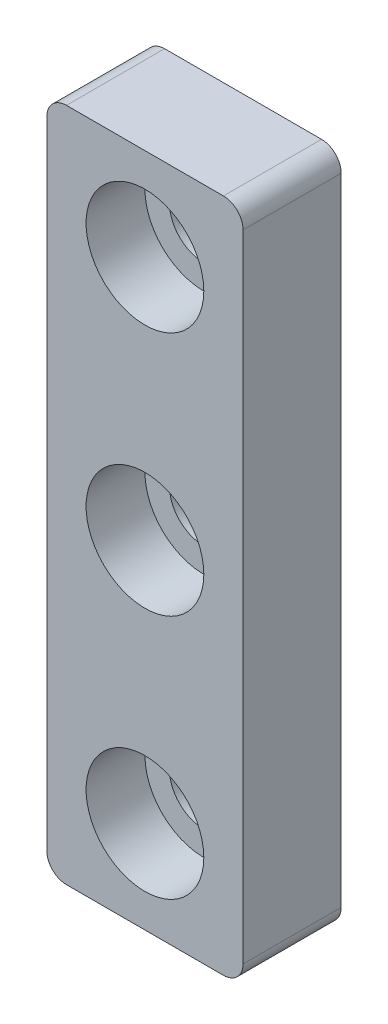
ISO-10303-21;
HEADER;
FILE_DESCRIPTION(('STEP AP214'),'2;1');
FILE_NAME('part.step','',(''),(''),'','','');
FILE_SCHEMA(('AUTOMOTIVE_DESIGN { 1 0 10303 214 1 1 1 1 }'));
ENDSEC;
DATA;
#1=APPLICATION_CONTEXT('core data for automotive mechanical design processes');
#2=APPLICATION_PROTOCOL_DEFINITION('international standard','automotive_design',2000,#1);
#3=PRODUCT_CONTEXT('',#1,'mechanical');
#4=PRODUCT('Part','Part','',(#3));
#5=PRODUCT_RELATED_PRODUCT_CATEGORY('part','',(#4));
#6=PRODUCT_DEFINITION_FORMATION('','',#4);
#7=PRODUCT_DEFINITION_CONTEXT('part definition',#1,'design');
#8=PRODUCT_DEFINITION('design','',#6,#7);
#9=PRODUCT_DEFINITION_SHAPE('','',#8);
#10=(LENGTH_UNIT() NAMED_UNIT(*) SI_UNIT(.MILLI.,.METRE.));
#11=(NAMED_UNIT(*) PLANE_ANGLE_UNIT() SI_UNIT($,.RADIAN.));
#12=(NAMED_UNIT(*) SI_UNIT($,.STERADIAN.) SOLID_ANGLE_UNIT());
#13=UNCERTAINTY_MEASURE_WITH_UNIT(LENGTH_MEASURE(1.E-05),#10,'distance_accuracy_value','');
#14=(GEOMETRIC_REPRESENTATION_CONTEXT(3) GLOBAL_UNCERTAINTY_ASSIGNED_CONTEXT((#13)) GLOBAL_UNIT_ASSIGNED_CONTEXT((#10,
#11,#12)) REPRESENTATION_CONTEXT('',''));
#15=CARTESIAN_POINT('',(0.,0.,0.));
#16=DIRECTION('',(0.,0.,1.));
#17=DIRECTION('',(1.,0.,0.));
#18=AXIS2_PLACEMENT_3D('',#15,#16,#17);
#19=CARTESIAN_POINT('',(0.,-12.5,0.));
#20=DIRECTION('',(0.,0.,1.));
#21=DIRECTION('',(1.,0.,0.));
#22=AXIS2_PLACEMENT_3D('',#19,#20,#21);
#23=CYLINDRICAL_SURFACE('',#22,1.75);
#24=CARTESIAN_POINT('',(0.,-12.5,0.));
#25=DIRECTION('',(0.,0.,1.));
#26=DIRECTION('',(1.,0.,0.));
#27=AXIS2_PLACEMENT_3D('',#24,#25,#26);
#28=CIRCLE('',#27,1.75);
#29=CARTESIAN_POINT('',(1.75,-12.5,0.));
#30=VERTEX_POINT('',#29);
#31=EDGE_CURVE('E167',#30,#30,#28,.T.);
#32=ORIENTED_EDGE('',*,*,#31,.F.);
#33=EDGE_LOOP('',(#32));
#34=FACE_BOUND('',#33,.T.);
#35=CARTESIAN_POINT('',(0.,-12.5,2.));
#36=DIRECTION('',(0.,0.,1.));
#37=DIRECTION('',(1.,0.,0.));
#38=AXIS2_PLACEMENT_3D('',#35,#36,#37);
#39=CIRCLE('',#38,1.75);
#40=CARTESIAN_POINT('',(1.75,-12.5,2.));
#41=VERTEX_POINT('',#40);
#42=EDGE_CURVE('E41',#41,#41,#39,.F.);
#43=ORIENTED_EDGE('',*,*,#42,.F.);
#44=EDGE_LOOP('',(#43));
#45=FACE_BOUND('',#44,.T.);
#46=ADVANCED_FACE('F37',(#34,#45),#23,.F.);
#47=CARTESIAN_POINT('',(0.,0.,0.));
#48=DIRECTION('',(0.,0.,1.));
#49=DIRECTION('',(1.,0.,0.));
#50=AXIS2_PLACEMENT_3D('',#47,#48,#49);
#51=CYLINDRICAL_SURFACE('',#50,1.75);
#52=CARTESIAN_POINT('',(0.,0.,0.));
#53=DIRECTION('',(0.,0.,1.));
#54=DIRECTION('',(1.,0.,0.));
#55=AXIS2_PLACEMENT_3D('',#52,#53,#54);
#56=CIRCLE('',#55,1.75);
#57=CARTESIAN_POINT('',(1.75,0.,0.));
#58=VERTEX_POINT('',#57);
#59=EDGE_CURVE('E137',#58,#58,#56,.T.);
#60=ORIENTED_EDGE('',*,*,#59,.F.);
#61=EDGE_LOOP('',(#60));
#62=FACE_BOUND('',#61,.T.);
#63=CARTESIAN_POINT('',(0.,0.,2.));
#64=DIRECTION('',(0.,0.,1.));
#65=DIRECTION('',(1.,0.,0.));
#66=AXIS2_PLACEMENT_3D('',#63,#64,#65);
#67=CIRCLE('',#66,1.75);
#68=CARTESIAN_POINT('',(1.75,0.,2.));
#69=VERTEX_POINT('',#68);
#70=EDGE_CURVE('E169',#69,#69,#67,.F.);
#71=ORIENTED_EDGE('',*,*,#70,.F.);
#72=EDGE_LOOP('',(#71));
#73=FACE_BOUND('',#72,.T.);
#74=ADVANCED_FACE('F229',(#62,#73),#51,.F.);
#75=CARTESIAN_POINT('',(0.,12.5,0.));
#76=DIRECTION('',(0.,0.,1.));
#77=DIRECTION('',(1.,0.,0.));
#78=AXIS2_PLACEMENT_3D('',#75,#76,#77);
#79=CYLINDRICAL_SURFACE('',#78,1.75);
#80=CARTESIAN_POINT('',(0.,12.5,0.));
#81=DIRECTION('',(0.,0.,1.));
#82=DIRECTION('',(1.,0.,0.));
#83=AXIS2_PLACEMENT_3D('',#80,#81,#82);
#84=CIRCLE('',#83,1.75);
#85=CARTESIAN_POINT('',(1.75,12.5,0.));
#86=VERTEX_POINT('',#85);
#87=EDGE_CURVE('E192',#86,#86,#84,.T.);
#88=ORIENTED_EDGE('',*,*,#87,.F.);
#89=EDGE_LOOP('',(#88));
#90=FACE_BOUND('',#89,.T.);
#91=CARTESIAN_POINT('',(0.,12.5,2.));
#92=DIRECTION('',(0.,0.,1.));
#93=DIRECTION('',(1.,0.,0.));
#94=AXIS2_PLACEMENT_3D('',#91,#92,#93);
#95=CIRCLE('',#94,1.75);
#96=CARTESIAN_POINT('',(1.75,12.5,2.));
#97=VERTEX_POINT('',#96);
#98=EDGE_CURVE('E165',#97,#97,#95,.F.);
#99=ORIENTED_EDGE('',*,*,#98,.F.);
#100=EDGE_LOOP('',(#99));
#101=FACE_BOUND('',#100,.T.);
#102=ADVANCED_FACE('F235',(#90,#101),#79,.F.);
#103=CARTESIAN_POINT('',(-5.,17.2,5.));
#104=DIRECTION('',(1.,0.,0.));
#105=DIRECTION('',(0.,1.,0.));
#106=AXIS2_PLACEMENT_3D('',#103,#104,#105);
#107=PLANE('',#106);
#108=DIRECTION('',(0.,-1.,0.));
#109=VECTOR('',#108,1.);
#110=CARTESIAN_POINT('',(-5.,17.2,0.));
#111=LINE('',#110,#109);
#112=CARTESIAN_POINT('',(-5.,16.2,0.));
#113=VERTEX_POINT('',#112);
#114=CARTESIAN_POINT('',(-5.,-16.2,0.));
#115=VERTEX_POINT('',#114);
#116=EDGE_CURVE('E132',#113,#115,#111,.T.);
#117=ORIENTED_EDGE('',*,*,#116,.T.);
#118=DIRECTION('',(0.,0.,-1.));
#119=VECTOR('',#118,1.);
#120=CARTESIAN_POINT('',(-5.,-16.2,5.));
#121=LINE('',#120,#119);
#122=CARTESIAN_POINT('',(-5.,-16.2,5.));
#123=VERTEX_POINT('',#122);
#124=EDGE_CURVE('E110',#115,#123,#121,.F.);
#125=ORIENTED_EDGE('',*,*,#124,.T.);
#126=DIRECTION('',(0.,-1.,0.));
#127=VECTOR('',#126,1.);
#128=CARTESIAN_POINT('',(-5.,17.2,5.));
#129=LINE('',#128,#127);
#130=CARTESIAN_POINT('',(-5.,16.2,5.));
#131=VERTEX_POINT('',#130);
#132=EDGE_CURVE('E142',#131,#123,#129,.T.);
#133=ORIENTED_EDGE('',*,*,#132,.F.);
#134=DIRECTION('',(0.,0.,-1.));
#135=VECTOR('',#134,1.);
#136=CARTESIAN_POINT('',(-5.,16.2,5.));
#137=LINE('',#136,#135);
#138=EDGE_CURVE('E115',#131,#113,#137,.T.);
#139=ORIENTED_EDGE('',*,*,#138,.T.);
#140=EDGE_LOOP('',(#117,#125,#133,#139));
#141=FACE_BOUND('',#140,.T.);
#142=ADVANCED_FACE('F208',(#141),#107,.F.);
#143=CARTESIAN_POINT('',(5.,-17.2,5.));
#144=DIRECTION('',(0.,1.,0.));
#145=DIRECTION('',(-1.,0.,0.));
#146=AXIS2_PLACEMENT_3D('',#143,#144,#145);
#147=PLANE('',#146);
#148=DIRECTION('',(1.,0.,0.));
#149=VECTOR('',#148,1.);
#150=CARTESIAN_POINT('',(5.,-17.2,5.));
#151=LINE('',#150,#149);
#152=CARTESIAN_POINT('',(-4.,-17.2,5.));
#153=VERTEX_POINT('',#152);
#154=CARTESIAN_POINT('',(4.,-17.2,5.));
#155=VERTEX_POINT('',#154);
#156=EDGE_CURVE('E125',#153,#155,#151,.T.);
#157=ORIENTED_EDGE('',*,*,#156,.F.);
#158=DIRECTION('',(0.,0.,-1.));
#159=VECTOR('',#158,1.);
#160=CARTESIAN_POINT('',(-4.,-17.2,5.));
#161=LINE('',#160,#159);
#162=CARTESIAN_POINT('',(-4.,-17.2,0.));
#163=VERTEX_POINT('',#162);
#164=EDGE_CURVE('E109',#153,#163,#161,.T.);
#165=ORIENTED_EDGE('',*,*,#164,.T.);
#166=DIRECTION('',(1.,0.,0.));
#167=VECTOR('',#166,1.);
#168=CARTESIAN_POINT('',(5.,-17.2,0.));
#169=LINE('',#168,#167);
#170=CARTESIAN_POINT('',(4.,-17.2,0.));
#171=VERTEX_POINT('',#170);
#172=EDGE_CURVE('E122',#163,#171,#169,.T.);
#173=ORIENTED_EDGE('',*,*,#172,.T.);
#174=DIRECTION('',(0.,0.,-1.));
#175=VECTOR('',#174,1.);
#176=CARTESIAN_POINT('',(4.,-17.2,5.));
#177=LINE('',#176,#175);
#178=EDGE_CURVE('E127',#171,#155,#177,.F.);
#179=ORIENTED_EDGE('',*,*,#178,.T.);
#180=EDGE_LOOP('',(#157,#165,#173,#179));
#181=FACE_BOUND('',#180,.T.);
#182=ADVANCED_FACE('F121',(#181),#147,.F.);
#183=CARTESIAN_POINT('',(5.,17.2,5.));
#184=DIRECTION('',(-1.,0.,0.));
#185=DIRECTION('',(0.,-1.,0.));
#186=AXIS2_PLACEMENT_3D('',#183,#184,#185);
#187=PLANE('',#186);
#188=DIRECTION('',(0.,1.,0.));
#189=VECTOR('',#188,1.);
#190=CARTESIAN_POINT('',(5.,17.2,5.));
#191=LINE('',#190,#189);
#192=CARTESIAN_POINT('',(5.,-16.2,5.));
#193=VERTEX_POINT('',#192);
#194=CARTESIAN_POINT('',(5.,16.2,5.));
#195=VERTEX_POINT('',#194);
#196=EDGE_CURVE('E200',#193,#195,#191,.T.);
#197=ORIENTED_EDGE('',*,*,#196,.F.);
#198=DIRECTION('',(0.,0.,-1.));
#199=VECTOR('',#198,1.);
#200=CARTESIAN_POINT('',(5.,-16.2,5.));
#201=LINE('',#200,#199);
#202=CARTESIAN_POINT('',(5.,-16.2,0.));
#203=VERTEX_POINT('',#202);
#204=EDGE_CURVE('E161',#193,#203,#201,.T.);
#205=ORIENTED_EDGE('',*,*,#204,.T.);
#206=DIRECTION('',(0.,1.,0.));
#207=VECTOR('',#206,1.);
#208=CARTESIAN_POINT('',(5.,17.2,0.));
#209=LINE('',#208,#207);
#210=CARTESIAN_POINT('',(5.,16.2,0.));
#211=VERTEX_POINT('',#210);
#212=EDGE_CURVE('E131',#203,#211,#209,.T.);
#213=ORIENTED_EDGE('',*,*,#212,.T.);
#214=DIRECTION('',(0.,0.,-1.));
#215=VECTOR('',#214,1.);
#216=CARTESIAN_POINT('',(5.,16.2,5.));
#217=LINE('',#216,#215);
#218=EDGE_CURVE('E159',#211,#195,#217,.F.);
#219=ORIENTED_EDGE('',*,*,#218,.T.);
#220=EDGE_LOOP('',(#197,#205,#213,#219));
#221=FACE_BOUND('',#220,.T.);
#222=ADVANCED_FACE('F216',(#221),#187,.F.);
#223=CARTESIAN_POINT('',(5.,17.2,5.));
#224=DIRECTION('',(0.,-1.,0.));
#225=DIRECTION('',(1.,0.,0.));
#226=AXIS2_PLACEMENT_3D('',#223,#224,#225);
#227=PLANE('',#226);
#228=DIRECTION('',(-1.,0.,0.));
#229=VECTOR('',#228,1.);
#230=CARTESIAN_POINT('',(5.,17.2,5.));
#231=LINE('',#230,#229);
#232=CARTESIAN_POINT('',(4.,17.2,5.));
#233=VERTEX_POINT('',#232);
#234=CARTESIAN_POINT('',(-4.,17.2,5.));
#235=VERTEX_POINT('',#234);
#236=EDGE_CURVE('E143',#233,#235,#231,.T.);
#237=ORIENTED_EDGE('',*,*,#236,.F.);
#238=DIRECTION('',(0.,0.,-1.));
#239=VECTOR('',#238,1.);
#240=CARTESIAN_POINT('',(4.,17.2,5.));
#241=LINE('',#240,#239);
#242=CARTESIAN_POINT('',(4.,17.2,0.));
#243=VERTEX_POINT('',#242);
#244=EDGE_CURVE('E11',#233,#243,#241,.T.);
#245=ORIENTED_EDGE('',*,*,#244,.T.);
#246=DIRECTION('',(-1.,0.,0.));
#247=VECTOR('',#246,1.);
#248=CARTESIAN_POINT('',(5.,17.2,0.));
#249=LINE('',#248,#247);
#250=CARTESIAN_POINT('',(-4.,17.2,0.));
#251=VERTEX_POINT('',#250);
#252=EDGE_CURVE('E135',#243,#251,#249,.T.);
#253=ORIENTED_EDGE('',*,*,#252,.T.);
#254=DIRECTION('',(0.,0.,-1.));
#255=VECTOR('',#254,1.);
#256=CARTESIAN_POINT('',(-4.,17.2,5.));
#257=LINE('',#256,#255);
#258=EDGE_CURVE('E46',#251,#235,#257,.F.);
#259=ORIENTED_EDGE('',*,*,#258,.T.);
#260=EDGE_LOOP('',(#237,#245,#253,#259));
#261=FACE_BOUND('',#260,.T.);
#262=ADVANCED_FACE('F210',(#261),#227,.F.);
#263=CARTESIAN_POINT('',(0.,0.,5.));
#264=DIRECTION('',(0.,0.,-1.));
#265=DIRECTION('',(-1.,0.,0.));
#266=AXIS2_PLACEMENT_3D('',#263,#264,#265);
#267=PLANE('',#266);
#268=CARTESIAN_POINT('',(0.,-12.5,5.));
#269=DIRECTION('',(0.,0.,1.));
#270=DIRECTION('',(1.,0.,0.));
#271=AXIS2_PLACEMENT_3D('',#268,#269,#270);
#272=CIRCLE('',#271,3.);
#273=CARTESIAN_POINT('',(3.,-12.5,5.));
#274=VERTEX_POINT('',#273);
#275=EDGE_CURVE('E185',#274,#274,#272,.T.);
#276=ORIENTED_EDGE('',*,*,#275,.F.);
#277=EDGE_LOOP('',(#276));
#278=FACE_BOUND('',#277,.T.);
#279=CARTESIAN_POINT('',(0.,0.,5.));
#280=DIRECTION('',(0.,0.,1.));
#281=DIRECTION('',(1.,0.,0.));
#282=AXIS2_PLACEMENT_3D('',#279,#280,#281);
#283=CIRCLE('',#282,3.);
#284=CARTESIAN_POINT('',(3.,0.,5.));
#285=VERTEX_POINT('',#284);
#286=EDGE_CURVE('E178',#285,#285,#283,.T.);
#287=ORIENTED_EDGE('',*,*,#286,.F.);
#288=EDGE_LOOP('',(#287));
#289=FACE_BOUND('',#288,.T.);
#290=CARTESIAN_POINT('',(0.,12.5,5.));
#291=DIRECTION('',(0.,0.,1.));
#292=DIRECTION('',(1.,0.,0.));
#293=AXIS2_PLACEMENT_3D('',#290,#291,#292);
#294=CIRCLE('',#293,3.);
#295=CARTESIAN_POINT('',(3.,12.5,5.));
#296=VERTEX_POINT('',#295);
#297=EDGE_CURVE('E171',#296,#296,#294,.T.);
#298=ORIENTED_EDGE('',*,*,#297,.F.);
#299=EDGE_LOOP('',(#298));
#300=FACE_BOUND('',#299,.T.);
#301=ORIENTED_EDGE('',*,*,#132,.T.);
#302=CARTESIAN_POINT('',(-4.,-16.2,5.));
#303=DIRECTION('',(0.,0.,-1.));
#304=DIRECTION('',(-1.,0.,0.));
#305=AXIS2_PLACEMENT_3D('',#302,#303,#304);
#306=CIRCLE('',#305,1.);
#307=EDGE_CURVE('E157',#123,#153,#306,.F.);
#308=ORIENTED_EDGE('',*,*,#307,.T.);
#309=ORIENTED_EDGE('',*,*,#156,.T.);
#310=CARTESIAN_POINT('',(4.,-16.2,5.));
#311=DIRECTION('',(0.,0.,-1.));
#312=DIRECTION('',(-1.,0.,0.));
#313=AXIS2_PLACEMENT_3D('',#310,#311,#312);
#314=CIRCLE('',#313,1.);
#315=EDGE_CURVE('E155',#155,#193,#314,.F.);
#316=ORIENTED_EDGE('',*,*,#315,.T.);
#317=ORIENTED_EDGE('',*,*,#196,.T.);
#318=CARTESIAN_POINT('',(4.,16.2,5.));
#319=DIRECTION('',(0.,0.,-1.));
#320=DIRECTION('',(-1.,0.,0.));
#321=AXIS2_PLACEMENT_3D('',#318,#319,#320);
#322=CIRCLE('',#321,1.);
#323=EDGE_CURVE('E60',#195,#233,#322,.F.);
#324=ORIENTED_EDGE('',*,*,#323,.T.);
#325=ORIENTED_EDGE('',*,*,#236,.T.);
#326=CARTESIAN_POINT('',(-4.,16.2,5.));
#327=DIRECTION('',(0.,0.,-1.));
#328=DIRECTION('',(-1.,0.,0.));
#329=AXIS2_PLACEMENT_3D('',#326,#327,#328);
#330=CIRCLE('',#329,1.);
#331=EDGE_CURVE('E152',#235,#131,#330,.F.);
#332=ORIENTED_EDGE('',*,*,#331,.T.);
#333=EDGE_LOOP('',(#301,#308,#309,#316,#317,#324,#325,#332));
#334=FACE_BOUND('',#333,.T.);
#335=ADVANCED_FACE('F202',(#278,#289,#300,#334),#267,.F.);
#336=CARTESIAN_POINT('',(0.,0.,0.));
#337=DIRECTION('',(0.,0.,-1.));
#338=DIRECTION('',(-1.,0.,0.));
#339=AXIS2_PLACEMENT_3D('',#336,#337,#338);
#340=PLANE('',#339);
#341=ORIENTED_EDGE('',*,*,#31,.T.);
#342=EDGE_LOOP('',(#341));
#343=FACE_BOUND('',#342,.T.);
#344=ORIENTED_EDGE('',*,*,#87,.T.);
#345=EDGE_LOOP('',(#344));
#346=FACE_BOUND('',#345,.T.);
#347=ORIENTED_EDGE('',*,*,#59,.T.);
#348=EDGE_LOOP('',(#347));
#349=FACE_BOUND('',#348,.T.);
#350=ORIENTED_EDGE('',*,*,#172,.F.);
#351=CARTESIAN_POINT('',(-4.,-16.2,0.));
#352=DIRECTION('',(0.,0.,-1.));
#353=DIRECTION('',(-1.,0.,0.));
#354=AXIS2_PLACEMENT_3D('',#351,#352,#353);
#355=CIRCLE('',#354,1.);
#356=EDGE_CURVE('E105',#163,#115,#355,.T.);
#357=ORIENTED_EDGE('',*,*,#356,.T.);
#358=ORIENTED_EDGE('',*,*,#116,.F.);
#359=CARTESIAN_POINT('',(-4.,16.2,0.));
#360=DIRECTION('',(0.,0.,-1.));
#361=DIRECTION('',(-1.,0.,0.));
#362=AXIS2_PLACEMENT_3D('',#359,#360,#361);
#363=CIRCLE('',#362,1.);
#364=EDGE_CURVE('E126',#113,#251,#363,.T.);
#365=ORIENTED_EDGE('',*,*,#364,.T.);
#366=ORIENTED_EDGE('',*,*,#252,.F.);
#367=CARTESIAN_POINT('',(4.,16.2,0.));
#368=DIRECTION('',(0.,0.,-1.));
#369=DIRECTION('',(-1.,0.,0.));
#370=AXIS2_PLACEMENT_3D('',#367,#368,#369);
#371=CIRCLE('',#370,1.);
#372=EDGE_CURVE('E146',#243,#211,#371,.T.);
#373=ORIENTED_EDGE('',*,*,#372,.T.);
#374=ORIENTED_EDGE('',*,*,#212,.F.);
#375=CARTESIAN_POINT('',(4.,-16.2,0.));
#376=DIRECTION('',(0.,0.,-1.));
#377=DIRECTION('',(-1.,0.,0.));
#378=AXIS2_PLACEMENT_3D('',#375,#376,#377);
#379=CIRCLE('',#378,1.);
#380=EDGE_CURVE('E116',#203,#171,#379,.T.);
#381=ORIENTED_EDGE('',*,*,#380,.T.);
#382=EDGE_LOOP('',(#350,#357,#358,#365,#366,#373,#374,#381));
#383=FACE_BOUND('',#382,.T.);
#384=ADVANCED_FACE('F129',(#343,#346,#349,#383),#340,.T.);
#385=CARTESIAN_POINT('',(-4.,-16.2,5.));
#386=DIRECTION('',(0.,0.,-1.));
#387=DIRECTION('',(-1.,0.,0.));
#388=AXIS2_PLACEMENT_3D('',#385,#386,#387);
#389=CYLINDRICAL_SURFACE('',#388,1.);
#390=ORIENTED_EDGE('',*,*,#307,.F.);
#391=ORIENTED_EDGE('',*,*,#124,.F.);
#392=ORIENTED_EDGE('',*,*,#356,.F.);
#393=ORIENTED_EDGE('',*,*,#164,.F.);
#394=EDGE_LOOP('',(#390,#391,#392,#393));
#395=FACE_BOUND('',#394,.T.);
#396=ADVANCED_FACE('F108',(#395),#389,.T.);
#397=CARTESIAN_POINT('',(4.,-16.2,5.));
#398=DIRECTION('',(0.,0.,-1.));
#399=DIRECTION('',(-1.,0.,0.));
#400=AXIS2_PLACEMENT_3D('',#397,#398,#399);
#401=CYLINDRICAL_SURFACE('',#400,1.);
#402=ORIENTED_EDGE('',*,*,#315,.F.);
#403=ORIENTED_EDGE('',*,*,#178,.F.);
#404=ORIENTED_EDGE('',*,*,#380,.F.);
#405=ORIENTED_EDGE('',*,*,#204,.F.);
#406=EDGE_LOOP('',(#402,#403,#404,#405));
#407=FACE_BOUND('',#406,.T.);
#408=ADVANCED_FACE('F220',(#407),#401,.T.);
#409=CARTESIAN_POINT('',(4.,16.2,5.));
#410=DIRECTION('',(0.,0.,-1.));
#411=DIRECTION('',(-1.,0.,0.));
#412=AXIS2_PLACEMENT_3D('',#409,#410,#411);
#413=CYLINDRICAL_SURFACE('',#412,1.);
#414=ORIENTED_EDGE('',*,*,#323,.F.);
#415=ORIENTED_EDGE('',*,*,#218,.F.);
#416=ORIENTED_EDGE('',*,*,#372,.F.);
#417=ORIENTED_EDGE('',*,*,#244,.F.);
#418=EDGE_LOOP('',(#414,#415,#416,#417));
#419=FACE_BOUND('',#418,.T.);
#420=ADVANCED_FACE('F212',(#419),#413,.T.);
#421=CARTESIAN_POINT('',(-4.,16.2,5.));
#422=DIRECTION('',(0.,0.,-1.));
#423=DIRECTION('',(-1.,0.,0.));
#424=AXIS2_PLACEMENT_3D('',#421,#422,#423);
#425=CYLINDRICAL_SURFACE('',#424,1.);
#426=ORIENTED_EDGE('',*,*,#331,.F.);
#427=ORIENTED_EDGE('',*,*,#258,.F.);
#428=ORIENTED_EDGE('',*,*,#364,.F.);
#429=ORIENTED_EDGE('',*,*,#138,.F.);
#430=EDGE_LOOP('',(#426,#427,#428,#429));
#431=FACE_BOUND('',#430,.T.);
#432=ADVANCED_FACE('F39',(#431),#425,.T.);
#433=CARTESIAN_POINT('',(0.,12.5,2.));
#434=DIRECTION('',(0.,0.,1.));
#435=DIRECTION('',(1.,0.,0.));
#436=AXIS2_PLACEMENT_3D('',#433,#434,#435);
#437=PLANE('',#436);
#438=CARTESIAN_POINT('',(0.,12.5,2.));
#439=DIRECTION('',(0.,0.,1.));
#440=DIRECTION('',(1.,0.,0.));
#441=AXIS2_PLACEMENT_3D('',#438,#439,#440);
#442=CIRCLE('',#441,3.);
#443=CARTESIAN_POINT('',(3.,12.5,2.));
#444=VERTEX_POINT('',#443);
#445=EDGE_CURVE('E168',#444,#444,#442,.T.);
#446=ORIENTED_EDGE('',*,*,#445,.T.);
#447=EDGE_LOOP('',(#446));
#448=FACE_BOUND('',#447,.T.);
#449=ORIENTED_EDGE('',*,*,#98,.T.);
#450=EDGE_LOOP('',(#449));
#451=FACE_BOUND('',#450,.T.);
#452=ADVANCED_FACE('F307',(#448,#451),#437,.T.);
#453=CARTESIAN_POINT('',(0.,12.5,2.));
#454=DIRECTION('',(0.,0.,1.));
#455=DIRECTION('',(1.,0.,0.));
#456=AXIS2_PLACEMENT_3D('',#453,#454,#455);
#457=CYLINDRICAL_SURFACE('',#456,3.);
#458=ORIENTED_EDGE('',*,*,#445,.F.);
#459=EDGE_LOOP('',(#458));
#460=FACE_BOUND('',#459,.T.);
#461=ORIENTED_EDGE('',*,*,#297,.T.);
#462=EDGE_LOOP('',(#461));
#463=FACE_BOUND('',#462,.T.);
#464=ADVANCED_FACE('F242',(#460,#463),#457,.F.);
#465=CARTESIAN_POINT('',(0.,0.,2.));
#466=DIRECTION('',(0.,0.,1.));
#467=DIRECTION('',(1.,0.,0.));
#468=AXIS2_PLACEMENT_3D('',#465,#466,#467);
#469=PLANE('',#468);
#470=CARTESIAN_POINT('',(0.,0.,2.));
#471=DIRECTION('',(0.,0.,1.));
#472=DIRECTION('',(1.,0.,0.));
#473=AXIS2_PLACEMENT_3D('',#470,#471,#472);
#474=CIRCLE('',#473,3.);
#475=CARTESIAN_POINT('',(3.,0.,2.));
#476=VERTEX_POINT('',#475);
#477=EDGE_CURVE('E172',#476,#476,#474,.T.);
#478=ORIENTED_EDGE('',*,*,#477,.T.);
#479=EDGE_LOOP('',(#478));
#480=FACE_BOUND('',#479,.T.);
#481=ORIENTED_EDGE('',*,*,#70,.T.);
#482=EDGE_LOOP('',(#481));
#483=FACE_BOUND('',#482,.T.);
#484=ADVANCED_FACE('F321',(#480,#483),#469,.T.);
#485=CARTESIAN_POINT('',(0.,0.,2.));
#486=DIRECTION('',(0.,0.,1.));
#487=DIRECTION('',(1.,0.,0.));
#488=AXIS2_PLACEMENT_3D('',#485,#486,#487);
#489=CYLINDRICAL_SURFACE('',#488,3.);
#490=ORIENTED_EDGE('',*,*,#477,.F.);
#491=EDGE_LOOP('',(#490));
#492=FACE_BOUND('',#491,.T.);
#493=ORIENTED_EDGE('',*,*,#286,.T.);
#494=EDGE_LOOP('',(#493));
#495=FACE_BOUND('',#494,.T.);
#496=ADVANCED_FACE('F328',(#492,#495),#489,.F.);
#497=CARTESIAN_POINT('',(0.,-12.5,2.));
#498=DIRECTION('',(0.,0.,1.));
#499=DIRECTION('',(1.,0.,0.));
#500=AXIS2_PLACEMENT_3D('',#497,#498,#499);
#501=PLANE('',#500);
#502=CARTESIAN_POINT('',(0.,-12.5,2.));
#503=DIRECTION('',(0.,0.,1.));
#504=DIRECTION('',(1.,0.,0.));
#505=AXIS2_PLACEMENT_3D('',#502,#503,#504);
#506=CIRCLE('',#505,3.);
#507=CARTESIAN_POINT('',(3.,-12.5,2.));
#508=VERTEX_POINT('',#507);
#509=EDGE_CURVE('E382',#508,#508,#506,.T.);
#510=ORIENTED_EDGE('',*,*,#509,.T.);
#511=EDGE_LOOP('',(#510));
#512=FACE_BOUND('',#511,.T.);
#513=ORIENTED_EDGE('',*,*,#42,.T.);
#514=EDGE_LOOP('',(#513));
#515=FACE_BOUND('',#514,.T.);
#516=ADVANCED_FACE('F335',(#512,#515),#501,.T.);
#517=CARTESIAN_POINT('',(0.,-12.5,2.));
#518=DIRECTION('',(0.,0.,1.));
#519=DIRECTION('',(1.,0.,0.));
#520=AXIS2_PLACEMENT_3D('',#517,#518,#519);
#521=CYLINDRICAL_SURFACE('',#520,3.);
#522=ORIENTED_EDGE('',*,*,#509,.F.);
#523=EDGE_LOOP('',(#522));
#524=FACE_BOUND('',#523,.T.);
#525=ORIENTED_EDGE('',*,*,#275,.T.);
#526=EDGE_LOOP('',(#525));
#527=FACE_BOUND('',#526,.T.);
#528=ADVANCED_FACE('F343',(#524,#527),#521,.F.);
#529=CLOSED_SHELL('',(#46,#74,#102,#142,#182,#222,#262,#335,#384,#396,#408,#420,#432,#452,#464,
#484,#496,#516,#528));
#530=MANIFOLD_SOLID_BREP('B2',#529);
#531=ADVANCED_BREP_SHAPE_REPRESENTATION('',(#18,#530),#14);
#532=SHAPE_DEFINITION_REPRESENTATION(#9,#531);
ENDSEC;
END-ISO-10303-21;
